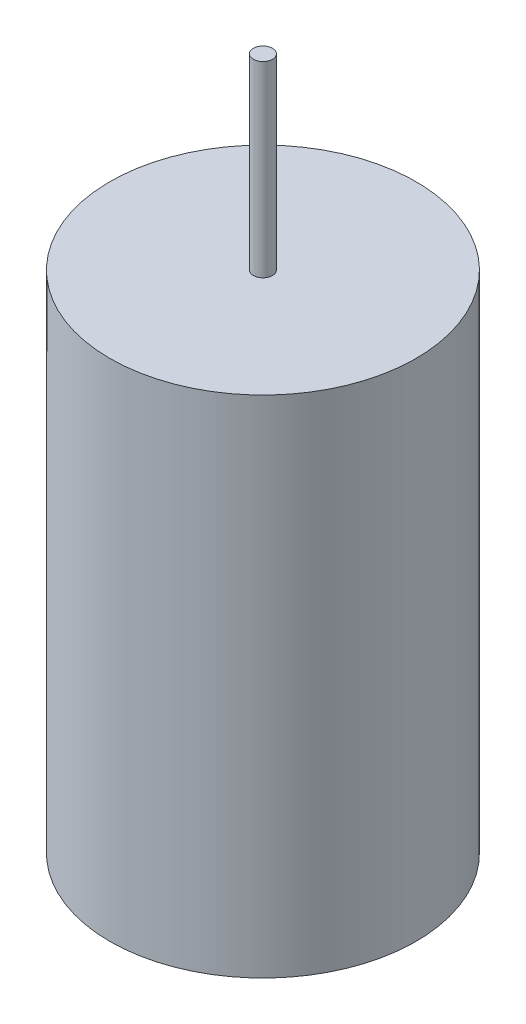
ISO-10303-21;
HEADER;
FILE_DESCRIPTION(('STEP AP214'),'2;1');
FILE_NAME('part.step','',(''),(''),'','','');
FILE_SCHEMA(('AUTOMOTIVE_DESIGN { 1 0 10303 214 1 1 1 1 }'));
ENDSEC;
DATA;
#1=APPLICATION_CONTEXT('core data for automotive mechanical design processes');
#2=APPLICATION_PROTOCOL_DEFINITION('international standard','automotive_design',2000,#1);
#3=PRODUCT_CONTEXT('',#1,'mechanical');
#4=PRODUCT('Part','Part','',(#3));
#5=PRODUCT_RELATED_PRODUCT_CATEGORY('part','',(#4));
#6=PRODUCT_DEFINITION_FORMATION('','',#4);
#7=PRODUCT_DEFINITION_CONTEXT('part definition',#1,'design');
#8=PRODUCT_DEFINITION('design','',#6,#7);
#9=PRODUCT_DEFINITION_SHAPE('','',#8);
#10=(LENGTH_UNIT() NAMED_UNIT(*) SI_UNIT(.MILLI.,.METRE.));
#11=(NAMED_UNIT(*) PLANE_ANGLE_UNIT() SI_UNIT($,.RADIAN.));
#12=(NAMED_UNIT(*) SI_UNIT($,.STERADIAN.) SOLID_ANGLE_UNIT());
#13=UNCERTAINTY_MEASURE_WITH_UNIT(LENGTH_MEASURE(1.E-05),#10,'distance_accuracy_value','');
#14=(GEOMETRIC_REPRESENTATION_CONTEXT(3) GLOBAL_UNCERTAINTY_ASSIGNED_CONTEXT((#13)) GLOBAL_UNIT_ASSIGNED_CONTEXT((#10,
#11,#12)) REPRESENTATION_CONTEXT('',''));
#15=CARTESIAN_POINT('',(0.,0.,0.));
#16=DIRECTION('',(0.,0.,1.));
#17=DIRECTION('',(1.,0.,0.));
#18=AXIS2_PLACEMENT_3D('',#15,#16,#17);
#19=CARTESIAN_POINT('',(0.,-62.,0.));
#20=DIRECTION('',(0.,1.,0.));
#21=DIRECTION('',(0.,0.,1.));
#22=AXIS2_PLACEMENT_3D('',#19,#20,#21);
#23=CYLINDRICAL_SURFACE('',#22,18.8);
#24=CARTESIAN_POINT('',(0.,-62.,0.));
#25=DIRECTION('',(0.,1.,0.));
#26=DIRECTION('',(0.,0.,1.));
#27=AXIS2_PLACEMENT_3D('',#24,#25,#26);
#28=CIRCLE('',#27,18.8);
#29=CARTESIAN_POINT('',(0.,-62.,18.8));
#30=VERTEX_POINT('',#29);
#31=EDGE_CURVE('E10',#30,#30,#28,.T.);
#32=ORIENTED_EDGE('',*,*,#31,.T.);
#33=EDGE_LOOP('',(#32));
#34=FACE_BOUND('',#33,.T.);
#35=CARTESIAN_POINT('',(0.,0.,0.));
#36=DIRECTION('',(0.,1.,0.));
#37=DIRECTION('',(0.,0.,1.));
#38=AXIS2_PLACEMENT_3D('',#35,#36,#37);
#39=CIRCLE('',#38,18.8);
#40=CARTESIAN_POINT('',(0.,0.,18.8));
#41=VERTEX_POINT('',#40);
#42=EDGE_CURVE('E40',#41,#41,#39,.T.);
#43=ORIENTED_EDGE('',*,*,#42,.F.);
#44=EDGE_LOOP('',(#43));
#45=FACE_BOUND('',#44,.T.);
#46=ADVANCED_FACE('F37',(#34,#45),#23,.T.);
#47=CARTESIAN_POINT('',(0.,-62.,0.));
#48=DIRECTION('',(0.,1.,0.));
#49=DIRECTION('',(0.,0.,1.));
#50=AXIS2_PLACEMENT_3D('',#47,#48,#49);
#51=PLANE('',#50);
#52=ORIENTED_EDGE('',*,*,#31,.F.);
#53=EDGE_LOOP('',(#52));
#54=FACE_BOUND('',#53,.T.);
#55=ADVANCED_FACE('F70',(#54),#51,.F.);
#56=CARTESIAN_POINT('',(0.,0.,0.));
#57=DIRECTION('',(0.,1.,0.));
#58=DIRECTION('',(0.,0.,1.));
#59=AXIS2_PLACEMENT_3D('',#56,#57,#58);
#60=PLANE('',#59);
#61=CARTESIAN_POINT('',(0.,0.,0.));
#62=DIRECTION('',(0.,1.,0.));
#63=DIRECTION('',(0.,0.,1.));
#64=AXIS2_PLACEMENT_3D('',#61,#62,#63);
#65=CIRCLE('',#64,1.17);
#66=CARTESIAN_POINT('',(0.,0.,1.17));
#67=VERTEX_POINT('',#66);
#68=EDGE_CURVE('E51',#67,#67,#65,.T.);
#69=ORIENTED_EDGE('',*,*,#68,.F.);
#70=EDGE_LOOP('',(#69));
#71=FACE_BOUND('',#70,.T.);
#72=ORIENTED_EDGE('',*,*,#42,.T.);
#73=EDGE_LOOP('',(#72));
#74=FACE_BOUND('',#73,.T.);
#75=ADVANCED_FACE('F64',(#71,#74),#60,.T.);
#76=CARTESIAN_POINT('',(0.,23.,0.));
#77=DIRECTION('',(0.,-1.,0.));
#78=DIRECTION('',(0.,0.,-1.));
#79=AXIS2_PLACEMENT_3D('',#76,#77,#78);
#80=CYLINDRICAL_SURFACE('',#79,1.17);
#81=CARTESIAN_POINT('',(0.,23.,0.));
#82=DIRECTION('',(0.,1.,0.));
#83=DIRECTION('',(0.,0.,1.));
#84=AXIS2_PLACEMENT_3D('',#81,#82,#83);
#85=CIRCLE('',#84,1.17);
#86=CARTESIAN_POINT('',(0.,23.,1.17));
#87=VERTEX_POINT('',#86);
#88=EDGE_CURVE('E49',#87,#87,#85,.T.);
#89=ORIENTED_EDGE('',*,*,#88,.F.);
#90=EDGE_LOOP('',(#89));
#91=FACE_BOUND('',#90,.T.);
#92=ORIENTED_EDGE('',*,*,#68,.T.);
#93=EDGE_LOOP('',(#92));
#94=FACE_BOUND('',#93,.T.);
#95=ADVANCED_FACE('F61',(#91,#94),#80,.T.);
#96=CARTESIAN_POINT('',(0.,23.,0.));
#97=DIRECTION('',(0.,1.,0.));
#98=DIRECTION('',(0.,0.,1.));
#99=AXIS2_PLACEMENT_3D('',#96,#97,#98);
#100=PLANE('',#99);
#101=ORIENTED_EDGE('',*,*,#88,.T.);
#102=EDGE_LOOP('',(#101));
#103=FACE_BOUND('',#102,.T.);
#104=ADVANCED_FACE('F59',(#103),#100,.T.);
#105=CLOSED_SHELL('',(#46,#55,#75,#95,#104));
#106=MANIFOLD_SOLID_BREP('B2',#105);
#107=ADVANCED_BREP_SHAPE_REPRESENTATION('',(#18,#106),#14);
#108=SHAPE_DEFINITION_REPRESENTATION(#9,#107);
ENDSEC;
END-ISO-10303-21;
